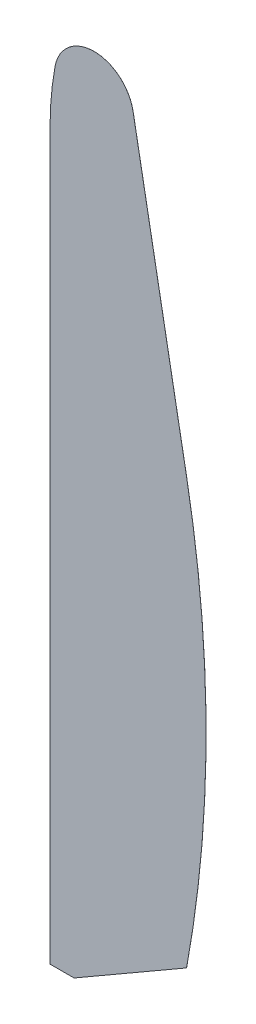
ISO-10303-21;
HEADER;
FILE_DESCRIPTION(('STEP AP214'),'2;1');
FILE_NAME('part.step','',(''),(''),'','','');
FILE_SCHEMA(('AUTOMOTIVE_DESIGN { 1 0 10303 214 1 1 1 1 }'));
ENDSEC;
DATA;
#1=APPLICATION_CONTEXT('core data for automotive mechanical design processes');
#2=APPLICATION_PROTOCOL_DEFINITION('international standard','automotive_design',2000,#1);
#3=PRODUCT_CONTEXT('',#1,'mechanical');
#4=PRODUCT('Part','Part','',(#3));
#5=PRODUCT_RELATED_PRODUCT_CATEGORY('part','',(#4));
#6=PRODUCT_DEFINITION_FORMATION('','',#4);
#7=PRODUCT_DEFINITION_CONTEXT('part definition',#1,'design');
#8=PRODUCT_DEFINITION('design','',#6,#7);
#9=PRODUCT_DEFINITION_SHAPE('','',#8);
#10=(LENGTH_UNIT() NAMED_UNIT(*) SI_UNIT(.MILLI.,.METRE.));
#11=(NAMED_UNIT(*) PLANE_ANGLE_UNIT() SI_UNIT($,.RADIAN.));
#12=(NAMED_UNIT(*) SI_UNIT($,.STERADIAN.) SOLID_ANGLE_UNIT());
#13=UNCERTAINTY_MEASURE_WITH_UNIT(LENGTH_MEASURE(1.E-05),#10,'distance_accuracy_value','');
#14=(GEOMETRIC_REPRESENTATION_CONTEXT(3) GLOBAL_UNCERTAINTY_ASSIGNED_CONTEXT((#13)) GLOBAL_UNIT_ASSIGNED_CONTEXT((#10,
#11,#12)) REPRESENTATION_CONTEXT('',''));
#15=CARTESIAN_POINT('',(0.,0.,0.));
#16=DIRECTION('',(0.,0.,1.));
#17=DIRECTION('',(1.,0.,0.));
#18=AXIS2_PLACEMENT_3D('',#15,#16,#17);
#19=CARTESIAN_POINT('',(9.16735310488902,160.998314401624,0.01));
#20=DIRECTION('',(0.,0.,-1.));
#21=DIRECTION('',(-1.,0.,0.));
#22=AXIS2_PLACEMENT_3D('',#19,#20,#21);
#23=CYLINDRICAL_SURFACE('',#22,8.26260761723378);
#24=CARTESIAN_POINT('',(9.16735310488902,160.998314401624,0.));
#25=DIRECTION('',(0.,0.,-1.));
#26=DIRECTION('',(-1.,0.,0.));
#27=AXIS2_PLACEMENT_3D('',#24,#25,#26);
#28=CIRCLE('',#27,8.26260761723378);
#29=CARTESIAN_POINT('',(1.04235310488903,162.5,0.));
#30=VERTEX_POINT('',#29);
#31=CARTESIAN_POINT('',(17.292353104889,162.5,0.));
#32=VERTEX_POINT('',#31);
#33=EDGE_CURVE('E129',#30,#32,#28,.T.);
#34=ORIENTED_EDGE('',*,*,#33,.F.);
#35=DIRECTION('',(0.,0.,-1.));
#36=VECTOR('',#35,1.);
#37=CARTESIAN_POINT('',(1.04235310488903,162.5,0.01));
#38=LINE('',#37,#36);
#39=CARTESIAN_POINT('',(1.04235310488903,162.5,0.01));
#40=VERTEX_POINT('',#39);
#41=EDGE_CURVE('E11',#40,#30,#38,.T.);
#42=ORIENTED_EDGE('',*,*,#41,.F.);
#43=CARTESIAN_POINT('',(9.16735310488902,160.998314401624,0.01));
#44=DIRECTION('',(0.,0.,-1.));
#45=DIRECTION('',(-1.,0.,0.));
#46=AXIS2_PLACEMENT_3D('',#43,#44,#45);
#47=CIRCLE('',#46,8.26260761723378);
#48=CARTESIAN_POINT('',(17.292353104889,162.5,0.01));
#49=VERTEX_POINT('',#48);
#50=EDGE_CURVE('E144',#40,#49,#47,.T.);
#51=ORIENTED_EDGE('',*,*,#50,.T.);
#52=DIRECTION('',(0.,0.,-1.));
#53=VECTOR('',#52,1.);
#54=CARTESIAN_POINT('',(17.292353104889,162.5,0.01));
#55=LINE('',#54,#53);
#56=EDGE_CURVE('E42',#49,#32,#55,.T.);
#57=ORIENTED_EDGE('',*,*,#56,.T.);
#58=EDGE_LOOP('',(#34,#42,#51,#57));
#59=FACE_BOUND('',#58,.T.);
#60=ADVANCED_FACE('F41',(#59),#23,.T.);
#61=CARTESIAN_POINT('',(62.5877758617909,151.125,0.01));
#62=DIRECTION('',(0.,0.,-1.));
#63=DIRECTION('',(-1.,0.,0.));
#64=AXIS2_PLACEMENT_3D('',#61,#62,#63);
#65=CYLINDRICAL_SURFACE('',#64,62.5877758617909);
#66=CARTESIAN_POINT('',(62.5877758617909,151.125,0.));
#67=DIRECTION('',(0.,0.,-1.));
#68=DIRECTION('',(-1.,0.,0.));
#69=AXIS2_PLACEMENT_3D('',#66,#67,#68);
#70=CIRCLE('',#69,62.5877758617909);
#71=CARTESIAN_POINT('',(0.,151.125,0.));
#72=VERTEX_POINT('',#71);
#73=EDGE_CURVE('E141',#72,#30,#70,.T.);
#74=ORIENTED_EDGE('',*,*,#73,.F.);
#75=DIRECTION('',(0.,0.,-1.));
#76=VECTOR('',#75,1.);
#77=CARTESIAN_POINT('',(0.,151.125,0.01));
#78=LINE('',#77,#76);
#79=CARTESIAN_POINT('',(0.,151.125,0.01));
#80=VERTEX_POINT('',#79);
#81=EDGE_CURVE('E49',#80,#72,#78,.T.);
#82=ORIENTED_EDGE('',*,*,#81,.F.);
#83=CARTESIAN_POINT('',(62.5877758617909,151.125,0.01));
#84=DIRECTION('',(0.,0.,-1.));
#85=DIRECTION('',(-1.,0.,0.));
#86=AXIS2_PLACEMENT_3D('',#83,#84,#85);
#87=CIRCLE('',#86,62.5877758617909);
#88=EDGE_CURVE('E123',#80,#40,#87,.T.);
#89=ORIENTED_EDGE('',*,*,#88,.T.);
#90=ORIENTED_EDGE('',*,*,#41,.T.);
#91=EDGE_LOOP('',(#74,#82,#89,#90));
#92=FACE_BOUND('',#91,.T.);
#93=ADVANCED_FACE('F160',(#92),#65,.T.);
#94=CARTESIAN_POINT('',(0.,0.,0.01));
#95=DIRECTION('',(-1.,0.,0.));
#96=DIRECTION('',(0.,0.,1.));
#97=AXIS2_PLACEMENT_3D('',#94,#95,#96);
#98=PLANE('',#97);
#99=DIRECTION('',(0.,1.,0.));
#100=VECTOR('',#99,1.);
#101=CARTESIAN_POINT('',(0.,0.,0.));
#102=LINE('',#101,#100);
#103=CARTESIAN_POINT('',(0.,0.,0.));
#104=VERTEX_POINT('',#103);
#105=EDGE_CURVE('E109',#104,#72,#102,.T.);
#106=ORIENTED_EDGE('',*,*,#105,.F.);
#107=DIRECTION('',(0.,0.,-1.));
#108=VECTOR('',#107,1.);
#109=CARTESIAN_POINT('',(0.,0.,0.01));
#110=LINE('',#109,#108);
#111=CARTESIAN_POINT('',(0.,0.,0.01));
#112=VERTEX_POINT('',#111);
#113=EDGE_CURVE('E102',#112,#104,#110,.T.);
#114=ORIENTED_EDGE('',*,*,#113,.F.);
#115=DIRECTION('',(0.,1.,0.));
#116=VECTOR('',#115,1.);
#117=CARTESIAN_POINT('',(0.,0.,0.01));
#118=LINE('',#117,#116);
#119=EDGE_CURVE('E107',#112,#80,#118,.T.);
#120=ORIENTED_EDGE('',*,*,#119,.T.);
#121=ORIENTED_EDGE('',*,*,#81,.T.);
#122=EDGE_LOOP('',(#106,#114,#120,#121));
#123=FACE_BOUND('',#122,.T.);
#124=ADVANCED_FACE('F106',(#123),#98,.T.);
#125=CARTESIAN_POINT('',(0.,0.,0.01));
#126=DIRECTION('',(0.,1.,0.));
#127=DIRECTION('',(-1.,0.,0.));
#128=AXIS2_PLACEMENT_3D('',#125,#126,#127);
#129=PLANE('',#128);
#130=DIRECTION('',(1.,0.,0.));
#131=VECTOR('',#130,1.);
#132=CARTESIAN_POINT('',(0.,0.,0.));
#133=LINE('',#132,#131);
#134=CARTESIAN_POINT('',(5.,0.,0.));
#135=VERTEX_POINT('',#134);
#136=EDGE_CURVE('E137',#104,#135,#133,.T.);
#137=ORIENTED_EDGE('',*,*,#136,.T.);
#138=DIRECTION('',(0.,0.,-1.));
#139=VECTOR('',#138,1.);
#140=CARTESIAN_POINT('',(5.,0.,0.01));
#141=LINE('',#140,#139);
#142=CARTESIAN_POINT('',(5.,0.,0.01));
#143=VERTEX_POINT('',#142);
#144=EDGE_CURVE('E114',#143,#135,#141,.T.);
#145=ORIENTED_EDGE('',*,*,#144,.F.);
#146=DIRECTION('',(1.,0.,0.));
#147=VECTOR('',#146,1.);
#148=CARTESIAN_POINT('',(0.,0.,0.01));
#149=LINE('',#148,#147);
#150=EDGE_CURVE('E119',#112,#143,#149,.T.);
#151=ORIENTED_EDGE('',*,*,#150,.F.);
#152=ORIENTED_EDGE('',*,*,#113,.T.);
#153=EDGE_LOOP('',(#137,#145,#151,#152));
#154=FACE_BOUND('',#153,.T.);
#155=ADVANCED_FACE('F116',(#154),#129,.F.);
#156=CARTESIAN_POINT('',(5.,0.,0.01));
#157=DIRECTION('',(-0.500000000000001,0.866025403784438,0.));
#158=DIRECTION('',(-0.866025403784438,-0.500000000000001,0.));
#159=AXIS2_PLACEMENT_3D('',#156,#157,#158);
#160=PLANE('',#159);
#161=DIRECTION('',(0.866025403784438,0.500000000000001,0.));
#162=VECTOR('',#161,1.);
#163=CARTESIAN_POINT('',(5.,0.,0.));
#164=LINE('',#163,#162);
#165=CARTESIAN_POINT('',(28.4375,13.5316469341319,0.));
#166=VERTEX_POINT('',#165);
#167=EDGE_CURVE('E140',#135,#166,#164,.T.);
#168=ORIENTED_EDGE('',*,*,#167,.T.);
#169=DIRECTION('',(0.,0.,-1.));
#170=VECTOR('',#169,1.);
#171=CARTESIAN_POINT('',(28.4375,13.5316469341319,0.01));
#172=LINE('',#171,#170);
#173=CARTESIAN_POINT('',(28.4375,13.5316469341319,0.01));
#174=VERTEX_POINT('',#173);
#175=EDGE_CURVE('E149',#174,#166,#172,.T.);
#176=ORIENTED_EDGE('',*,*,#175,.F.);
#177=DIRECTION('',(0.866025403784438,0.500000000000001,0.));
#178=VECTOR('',#177,1.);
#179=CARTESIAN_POINT('',(5.,0.,0.01));
#180=LINE('',#179,#178);
#181=EDGE_CURVE('E124',#143,#174,#180,.T.);
#182=ORIENTED_EDGE('',*,*,#181,.F.);
#183=ORIENTED_EDGE('',*,*,#144,.T.);
#184=EDGE_LOOP('',(#168,#176,#182,#183));
#185=FACE_BOUND('',#184,.T.);
#186=ADVANCED_FACE('F168',(#185),#160,.F.);
#187=CARTESIAN_POINT('',(-211.431579659462,57.8649321550936,0.01));
#188=DIRECTION('',(0.,0.,-1.));
#189=DIRECTION('',(-1.,0.,0.));
#190=AXIS2_PLACEMENT_3D('',#187,#188,#189);
#191=CYLINDRICAL_SURFACE('',#190,243.931579659462);
#192=CARTESIAN_POINT('',(-211.431579659462,57.8649321550936,0.));
#193=DIRECTION('',(0.,0.,1.));
#194=DIRECTION('',(1.,0.,0.));
#195=AXIS2_PLACEMENT_3D('',#192,#193,#194);
#196=CIRCLE('',#195,243.931579659462);
#197=CARTESIAN_POINT('',(28.4375,102.198217376055,0.));
#198=VERTEX_POINT('',#197);
#199=EDGE_CURVE('E132',#166,#198,#196,.T.);
#200=ORIENTED_EDGE('',*,*,#199,.T.);
#201=DIRECTION('',(0.,0.,-1.));
#202=VECTOR('',#201,1.);
#203=CARTESIAN_POINT('',(28.4375,102.198217376055,0.01));
#204=LINE('',#203,#202);
#205=CARTESIAN_POINT('',(28.4375,102.198217376055,0.01));
#206=VERTEX_POINT('',#205);
#207=EDGE_CURVE('E151',#206,#198,#204,.T.);
#208=ORIENTED_EDGE('',*,*,#207,.F.);
#209=CARTESIAN_POINT('',(-211.431579659462,57.8649321550936,0.01));
#210=DIRECTION('',(0.,0.,1.));
#211=DIRECTION('',(1.,0.,0.));
#212=AXIS2_PLACEMENT_3D('',#209,#210,#211);
#213=CIRCLE('',#212,243.931579659462);
#214=EDGE_CURVE('E232',#174,#206,#213,.T.);
#215=ORIENTED_EDGE('',*,*,#214,.F.);
#216=ORIENTED_EDGE('',*,*,#175,.T.);
#217=EDGE_LOOP('',(#200,#208,#215,#216));
#218=FACE_BOUND('',#217,.T.);
#219=ADVANCED_FACE('F175',(#218),#191,.T.);
#220=CARTESIAN_POINT('',(17.292353104889,162.5,0.01));
#221=DIRECTION('',(0.983345739794448,0.18174475515984,0.));
#222=DIRECTION('',(-0.18174475515984,0.983345739794448,0.));
#223=AXIS2_PLACEMENT_3D('',#220,#221,#222);
#224=PLANE('',#223);
#225=DIRECTION('',(0.18174475515984,-0.983345739794448,0.));
#226=VECTOR('',#225,1.);
#227=CARTESIAN_POINT('',(17.292353104889,162.5,0.));
#228=LINE('',#227,#226);
#229=EDGE_CURVE('E131',#32,#198,#228,.T.);
#230=ORIENTED_EDGE('',*,*,#229,.F.);
#231=ORIENTED_EDGE('',*,*,#56,.F.);
#232=DIRECTION('',(0.18174475515984,-0.983345739794448,0.));
#233=VECTOR('',#232,1.);
#234=CARTESIAN_POINT('',(17.292353104889,162.5,0.01));
#235=LINE('',#234,#233);
#236=EDGE_CURVE('E237',#49,#206,#235,.T.);
#237=ORIENTED_EDGE('',*,*,#236,.T.);
#238=ORIENTED_EDGE('',*,*,#207,.T.);
#239=EDGE_LOOP('',(#230,#231,#237,#238));
#240=FACE_BOUND('',#239,.T.);
#241=ADVANCED_FACE('F153',(#240),#224,.T.);
#242=CARTESIAN_POINT('',(9.16735310488902,160.998314401624,0.01));
#243=DIRECTION('',(0.,0.,-1.));
#244=DIRECTION('',(-1.,0.,0.));
#245=AXIS2_PLACEMENT_3D('',#242,#243,#244);
#246=PLANE('',#245);
#247=ORIENTED_EDGE('',*,*,#50,.F.);
#248=ORIENTED_EDGE('',*,*,#88,.F.);
#249=ORIENTED_EDGE('',*,*,#119,.F.);
#250=ORIENTED_EDGE('',*,*,#150,.T.);
#251=ORIENTED_EDGE('',*,*,#181,.T.);
#252=ORIENTED_EDGE('',*,*,#214,.T.);
#253=ORIENTED_EDGE('',*,*,#236,.F.);
#254=EDGE_LOOP('',(#247,#248,#249,#250,#251,#252,#253));
#255=FACE_BOUND('',#254,.T.);
#256=ADVANCED_FACE('F125',(#255),#246,.F.);
#257=CARTESIAN_POINT('',(9.16735310488902,160.998314401624,0.));
#258=DIRECTION('',(0.,0.,-1.));
#259=DIRECTION('',(-1.,0.,0.));
#260=AXIS2_PLACEMENT_3D('',#257,#258,#259);
#261=PLANE('',#260);
#262=ORIENTED_EDGE('',*,*,#33,.T.);
#263=ORIENTED_EDGE('',*,*,#229,.T.);
#264=ORIENTED_EDGE('',*,*,#199,.F.);
#265=ORIENTED_EDGE('',*,*,#167,.F.);
#266=ORIENTED_EDGE('',*,*,#136,.F.);
#267=ORIENTED_EDGE('',*,*,#105,.T.);
#268=ORIENTED_EDGE('',*,*,#73,.T.);
#269=EDGE_LOOP('',(#262,#263,#264,#265,#266,#267,#268));
#270=FACE_BOUND('',#269,.T.);
#271=ADVANCED_FACE('F156',(#270),#261,.T.);
#272=CLOSED_SHELL('',(#60,#93,#124,#155,#186,#219,#241,#256,#271));
#273=MANIFOLD_SOLID_BREP('B2',#272);
#274=ADVANCED_BREP_SHAPE_REPRESENTATION('',(#18,#273),#14);
#275=SHAPE_DEFINITION_REPRESENTATION(#9,#274);
ENDSEC;
END-ISO-10303-21;
